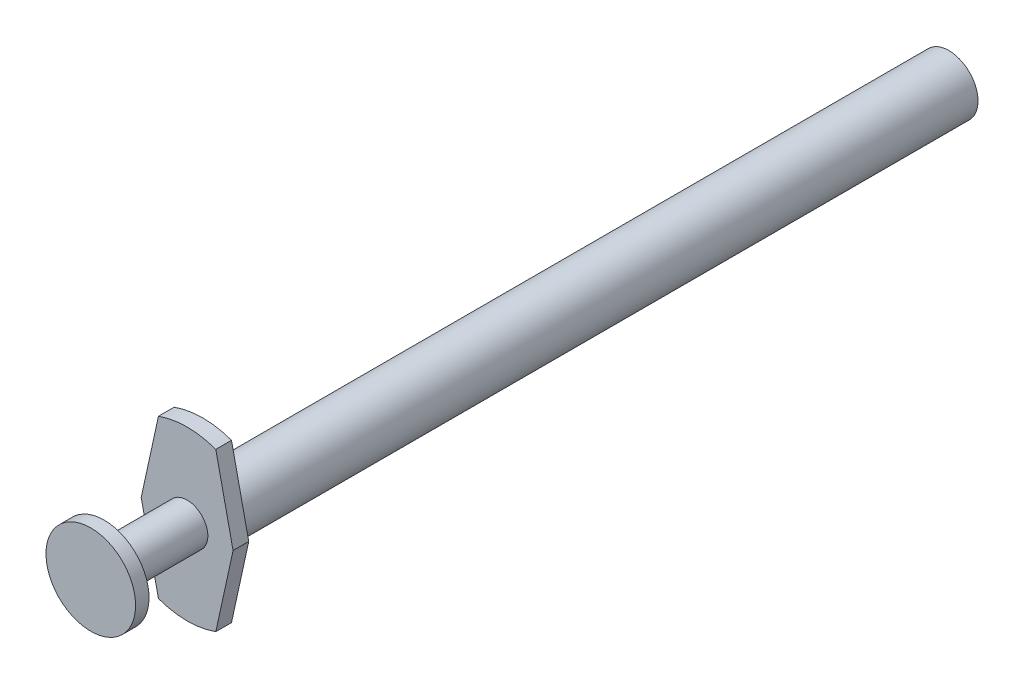
ISO-10303-21;
HEADER;
FILE_DESCRIPTION(('STEP AP214'),'2;1');
FILE_NAME('part.step','',(''),(''),'','','');
FILE_SCHEMA(('AUTOMOTIVE_DESIGN { 1 0 10303 214 1 1 1 1 }'));
ENDSEC;
DATA;
#1=APPLICATION_CONTEXT('core data for automotive mechanical design processes');
#2=APPLICATION_PROTOCOL_DEFINITION('international standard','automotive_design',2000,#1);
#3=PRODUCT_CONTEXT('',#1,'mechanical');
#4=PRODUCT('Part','Part','',(#3));
#5=PRODUCT_RELATED_PRODUCT_CATEGORY('part','',(#4));
#6=PRODUCT_DEFINITION_FORMATION('','',#4);
#7=PRODUCT_DEFINITION_CONTEXT('part definition',#1,'design');
#8=PRODUCT_DEFINITION('design','',#6,#7);
#9=PRODUCT_DEFINITION_SHAPE('','',#8);
#10=(LENGTH_UNIT() NAMED_UNIT(*) SI_UNIT(.MILLI.,.METRE.));
#11=(NAMED_UNIT(*) PLANE_ANGLE_UNIT() SI_UNIT($,.RADIAN.));
#12=(NAMED_UNIT(*) SI_UNIT($,.STERADIAN.) SOLID_ANGLE_UNIT());
#13=UNCERTAINTY_MEASURE_WITH_UNIT(LENGTH_MEASURE(1.E-05),#10,'distance_accuracy_value','');
#14=(GEOMETRIC_REPRESENTATION_CONTEXT(3) GLOBAL_UNCERTAINTY_ASSIGNED_CONTEXT((#13)) GLOBAL_UNIT_ASSIGNED_CONTEXT((#10,
#11,#12)) REPRESENTATION_CONTEXT('',''));
#15=CARTESIAN_POINT('',(0.,0.,0.));
#16=DIRECTION('',(0.,0.,1.));
#17=DIRECTION('',(1.,0.,0.));
#18=AXIS2_PLACEMENT_3D('',#15,#16,#17);
#19=CARTESIAN_POINT('',(0.,0.,-97.282));
#20=DIRECTION('',(0.,0.,-1.));
#21=DIRECTION('',(0.,1.,0.));
#22=AXIS2_PLACEMENT_3D('',#19,#20,#21);
#23=CYLINDRICAL_SURFACE('',#22,9.52499999999999);
#24=CARTESIAN_POINT('',(0.,0.,-12.7));
#25=DIRECTION('',(0.,0.,-1.));
#26=DIRECTION('',(0.,1.,0.));
#27=AXIS2_PLACEMENT_3D('',#24,#25,#26);
#28=CIRCLE('',#27,9.52499999999999);
#29=CARTESIAN_POINT('',(3.25214663047552,-8.95260673177854,-12.7));
#30=VERTEX_POINT('',#29);
#31=CARTESIAN_POINT('',(-3.25214663047552,-8.95260673177854,-12.7));
#32=VERTEX_POINT('',#31);
#33=EDGE_CURVE('E167',#30,#32,#28,.T.);
#34=ORIENTED_EDGE('',*,*,#33,.F.);
#35=DIRECTION('',(0.,0.,-1.));
#36=VECTOR('',#35,1.);
#37=CARTESIAN_POINT('',(3.25214663047553,-8.95260673177851,-97.282));
#38=LINE('',#37,#36);
#39=CARTESIAN_POINT('',(3.25214663047552,-8.95260673177854,-10.922));
#40=VERTEX_POINT('',#39);
#41=EDGE_CURVE('E94',#30,#40,#38,.F.);
#42=ORIENTED_EDGE('',*,*,#41,.T.);
#43=CARTESIAN_POINT('',(0.,0.,-10.922));
#44=DIRECTION('',(0.,0.,-1.));
#45=DIRECTION('',(0.,1.,0.));
#46=AXIS2_PLACEMENT_3D('',#43,#44,#45);
#47=CIRCLE('',#46,9.52499999999999);
#48=CARTESIAN_POINT('',(-3.25214663047552,-8.95260673177854,-10.922));
#49=VERTEX_POINT('',#48);
#50=EDGE_CURVE('E145',#40,#49,#47,.T.);
#51=ORIENTED_EDGE('',*,*,#50,.T.);
#52=DIRECTION('',(0.,0.,-1.));
#53=VECTOR('',#52,1.);
#54=CARTESIAN_POINT('',(-3.25214663047553,-8.95260673177851,-97.282));
#55=LINE('',#54,#53);
#56=EDGE_CURVE('E138',#49,#32,#55,.T.);
#57=ORIENTED_EDGE('',*,*,#56,.T.);
#58=EDGE_LOOP('',(#34,#42,#51,#57));
#59=FACE_BOUND('',#58,.T.);
#60=ADVANCED_FACE('F71',(#59),#23,.T.);
#61=CARTESIAN_POINT('',(0.,0.,0.));
#62=DIRECTION('',(0.,0.,1.));
#63=DIRECTION('',(0.,-1.,0.));
#64=AXIS2_PLACEMENT_3D('',#61,#62,#63);
#65=PLANE('',#64);
#66=CARTESIAN_POINT('',(0.,0.,0.));
#67=DIRECTION('',(0.,0.,-1.));
#68=DIRECTION('',(0.,1.,0.));
#69=AXIS2_PLACEMENT_3D('',#66,#67,#68);
#70=CIRCLE('',#69,5.08);
#71=CARTESIAN_POINT('',(0.,5.08,0.));
#72=VERTEX_POINT('',#71);
#73=EDGE_CURVE('E179',#72,#72,#70,.T.);
#74=ORIENTED_EDGE('',*,*,#73,.F.);
#75=EDGE_LOOP('',(#74));
#76=FACE_BOUND('',#75,.T.);
#77=ADVANCED_FACE('F73',(#76),#65,.T.);
#78=CARTESIAN_POINT('',(0.,0.,-97.282));
#79=DIRECTION('',(0.,0.,-1.));
#80=DIRECTION('',(0.,1.,0.));
#81=AXIS2_PLACEMENT_3D('',#78,#79,#80);
#82=CYLINDRICAL_SURFACE('',#81,5.08);
#83=ORIENTED_EDGE('',*,*,#73,.T.);
#84=EDGE_LOOP('',(#83));
#85=FACE_BOUND('',#84,.T.);
#86=CARTESIAN_POINT('',(0.,0.,-1.524));
#87=DIRECTION('',(0.,0.,-1.));
#88=DIRECTION('',(0.,1.,0.));
#89=AXIS2_PLACEMENT_3D('',#86,#87,#88);
#90=CIRCLE('',#89,5.08);
#91=CARTESIAN_POINT('',(0.,5.08,-1.524));
#92=VERTEX_POINT('',#91);
#93=EDGE_CURVE('E176',#92,#92,#90,.T.);
#94=ORIENTED_EDGE('',*,*,#93,.F.);
#95=EDGE_LOOP('',(#94));
#96=FACE_BOUND('',#95,.T.);
#97=ADVANCED_FACE('F215',(#85,#96),#82,.T.);
#98=CARTESIAN_POINT('',(0.,5.08,-1.524));
#99=DIRECTION('',(0.,0.,-1.));
#100=DIRECTION('',(0.,1.,0.));
#101=AXIS2_PLACEMENT_3D('',#98,#99,#100);
#102=PLANE('',#101);
#103=ORIENTED_EDGE('',*,*,#93,.T.);
#104=EDGE_LOOP('',(#103));
#105=FACE_BOUND('',#104,.T.);
#106=CARTESIAN_POINT('',(0.,0.,-1.524));
#107=DIRECTION('',(0.,0.,-1.));
#108=DIRECTION('',(0.,1.,0.));
#109=AXIS2_PLACEMENT_3D('',#106,#107,#108);
#110=CIRCLE('',#109,2.34949999999999);
#111=CARTESIAN_POINT('',(0.,2.34949999999999,-1.524));
#112=VERTEX_POINT('',#111);
#113=EDGE_CURVE('E173',#112,#112,#110,.T.);
#114=ORIENTED_EDGE('',*,*,#113,.F.);
#115=EDGE_LOOP('',(#114));
#116=FACE_BOUND('',#115,.T.);
#117=ADVANCED_FACE('F220',(#105,#116),#102,.T.);
#118=CARTESIAN_POINT('',(0.,0.,-97.282));
#119=DIRECTION('',(0.,0.,-1.));
#120=DIRECTION('',(0.,1.,0.));
#121=AXIS2_PLACEMENT_3D('',#118,#119,#120);
#122=CYLINDRICAL_SURFACE('',#121,2.34949999999999);
#123=ORIENTED_EDGE('',*,*,#113,.T.);
#124=EDGE_LOOP('',(#123));
#125=FACE_BOUND('',#124,.T.);
#126=CARTESIAN_POINT('',(0.,0.,-10.922));
#127=DIRECTION('',(0.,0.,-1.));
#128=DIRECTION('',(0.,1.,0.));
#129=AXIS2_PLACEMENT_3D('',#126,#127,#128);
#130=CIRCLE('',#129,2.34949999999998);
#131=CARTESIAN_POINT('',(0.,2.34949999999999,-10.922));
#132=VERTEX_POINT('',#131);
#133=EDGE_CURVE('E170',#132,#132,#130,.T.);
#134=ORIENTED_EDGE('',*,*,#133,.F.);
#135=EDGE_LOOP('',(#134));
#136=FACE_BOUND('',#135,.T.);
#137=ADVANCED_FACE('F209',(#125,#136),#122,.T.);
#138=CARTESIAN_POINT('',(0.,2.34949999999999,-10.922));
#139=DIRECTION('',(0.,0.,1.));
#140=DIRECTION('',(0.,-1.,0.));
#141=AXIS2_PLACEMENT_3D('',#138,#139,#140);
#142=PLANE('',#141);
#143=DIRECTION('',(0.213329300785652,-0.976980352630648,0.));
#144=VECTOR('',#143,1.);
#145=CARTESIAN_POINT('',(0.,23.8464040214486,-10.922));
#146=LINE('',#145,#144);
#147=CARTESIAN_POINT('',(3.25214663047552,8.95260673177856,-10.922));
#148=VERTEX_POINT('',#147);
#149=CARTESIAN_POINT('',(5.207,0.,-10.922));
#150=VERTEX_POINT('',#149);
#151=EDGE_CURVE('E123',#148,#150,#146,.T.);
#152=ORIENTED_EDGE('',*,*,#151,.F.);
#153=CARTESIAN_POINT('',(-3.25214663047552,8.95260673177856,-10.922));
#154=VERTEX_POINT('',#153);
#155=EDGE_CURVE('E168',#154,#148,#47,.T.);
#156=ORIENTED_EDGE('',*,*,#155,.F.);
#157=DIRECTION('',(0.213329300785652,0.976980352630648,0.));
#158=VECTOR('',#157,1.);
#159=CARTESIAN_POINT('',(-5.207,0.,-10.922));
#160=LINE('',#159,#158);
#161=CARTESIAN_POINT('',(-5.207,0.,-10.922));
#162=VERTEX_POINT('',#161);
#163=EDGE_CURVE('E135',#162,#154,#160,.T.);
#164=ORIENTED_EDGE('',*,*,#163,.F.);
#165=DIRECTION('',(0.213329300785652,-0.976980352630648,0.));
#166=VECTOR('',#165,1.);
#167=CARTESIAN_POINT('',(-5.207,0.,-10.922));
#168=LINE('',#167,#166);
#169=EDGE_CURVE('E146',#162,#49,#168,.T.);
#170=ORIENTED_EDGE('',*,*,#169,.T.);
#171=ORIENTED_EDGE('',*,*,#50,.F.);
#172=DIRECTION('',(0.213329300785652,0.976980352630648,0.));
#173=VECTOR('',#172,1.);
#174=CARTESIAN_POINT('',(0.,-23.8464040214486,-10.922));
#175=LINE('',#174,#173);
#176=EDGE_CURVE('E134',#40,#150,#175,.T.);
#177=ORIENTED_EDGE('',*,*,#176,.T.);
#178=EDGE_LOOP('',(#152,#156,#164,#170,#171,#177));
#179=FACE_BOUND('',#178,.T.);
#180=ORIENTED_EDGE('',*,*,#133,.T.);
#181=EDGE_LOOP('',(#180));
#182=FACE_BOUND('',#181,.T.);
#183=ADVANCED_FACE('F141',(#179,#182),#142,.T.);
#184=DIRECTION('',(0.,0.,-1.));
#185=VECTOR('',#184,1.);
#186=CARTESIAN_POINT('',(-3.25214663047551,8.95260673177858,-97.282));
#187=LINE('',#186,#185);
#188=CARTESIAN_POINT('',(-3.25214663047552,8.95260673177855,-12.7));
#189=VERTEX_POINT('',#188);
#190=EDGE_CURVE('E156',#154,#189,#187,.T.);
#191=ORIENTED_EDGE('',*,*,#190,.F.);
#192=ORIENTED_EDGE('',*,*,#155,.T.);
#193=DIRECTION('',(0.,0.,-1.));
#194=VECTOR('',#193,1.);
#195=CARTESIAN_POINT('',(3.25214663047551,8.95260673177858,-97.282));
#196=LINE('',#195,#194);
#197=CARTESIAN_POINT('',(3.25214663047552,8.95260673177855,-12.7));
#198=VERTEX_POINT('',#197);
#199=EDGE_CURVE('E129',#198,#148,#196,.F.);
#200=ORIENTED_EDGE('',*,*,#199,.F.);
#201=EDGE_CURVE('E164',#189,#198,#28,.T.);
#202=ORIENTED_EDGE('',*,*,#201,.F.);
#203=EDGE_LOOP('',(#191,#192,#200,#202));
#204=FACE_BOUND('',#203,.T.);
#205=ADVANCED_FACE('F200',(#204),#23,.T.);
#206=CARTESIAN_POINT('',(0.,9.52499999999999,-12.7));
#207=DIRECTION('',(0.,0.,-1.));
#208=DIRECTION('',(0.,1.,0.));
#209=AXIS2_PLACEMENT_3D('',#206,#207,#208);
#210=PLANE('',#209);
#211=DIRECTION('',(-0.213329300785652,0.976980352630648,0.));
#212=VECTOR('',#211,1.);
#213=CARTESIAN_POINT('',(2.98484605256892,10.1767583691758,-12.7));
#214=LINE('',#213,#212);
#215=CARTESIAN_POINT('',(5.207,0.,-12.7));
#216=VERTEX_POINT('',#215);
#217=EDGE_CURVE('E15',#216,#198,#214,.T.);
#218=ORIENTED_EDGE('',*,*,#217,.F.);
#219=DIRECTION('',(-0.213329300785652,-0.976980352630648,0.));
#220=VECTOR('',#219,1.);
#221=CARTESIAN_POINT('',(6.95521915399662,8.00628774039531,-12.7));
#222=LINE('',#221,#220);
#223=EDGE_CURVE('E79',#216,#30,#222,.T.);
#224=ORIENTED_EDGE('',*,*,#223,.T.);
#225=ORIENTED_EDGE('',*,*,#33,.T.);
#226=DIRECTION('',(-0.213329300785652,0.976980352630648,0.));
#227=VECTOR('',#226,1.);
#228=CARTESIAN_POINT('',(-6.95521915399662,8.00628774039531,-12.7));
#229=LINE('',#228,#227);
#230=CARTESIAN_POINT('',(-5.207,0.,-12.7));
#231=VERTEX_POINT('',#230);
#232=EDGE_CURVE('E182',#32,#231,#229,.T.);
#233=ORIENTED_EDGE('',*,*,#232,.T.);
#234=DIRECTION('',(-0.213329300785652,-0.976980352630648,0.));
#235=VECTOR('',#234,1.);
#236=CARTESIAN_POINT('',(-2.98484605256892,10.1767583691758,-12.7));
#237=LINE('',#236,#235);
#238=EDGE_CURVE('E185',#189,#231,#237,.T.);
#239=ORIENTED_EDGE('',*,*,#238,.F.);
#240=ORIENTED_EDGE('',*,*,#201,.T.);
#241=EDGE_LOOP('',(#218,#224,#225,#233,#239,#240));
#242=FACE_BOUND('',#241,.T.);
#243=CARTESIAN_POINT('',(0.,0.,-12.7));
#244=DIRECTION('',(0.,0.,-1.));
#245=DIRECTION('',(0.,1.,0.));
#246=AXIS2_PLACEMENT_3D('',#243,#244,#245);
#247=CIRCLE('',#246,3.30200000000003);
#248=CARTESIAN_POINT('',(0.,3.30200000000003,-12.7));
#249=VERTEX_POINT('',#248);
#250=EDGE_CURVE('E161',#249,#249,#247,.T.);
#251=ORIENTED_EDGE('',*,*,#250,.F.);
#252=EDGE_LOOP('',(#251));
#253=FACE_BOUND('',#252,.T.);
#254=ADVANCED_FACE('F189',(#242,#253),#210,.T.);
#255=CARTESIAN_POINT('',(0.,0.,-97.282));
#256=DIRECTION('',(0.,0.,-1.));
#257=DIRECTION('',(0.,1.,0.));
#258=AXIS2_PLACEMENT_3D('',#255,#256,#257);
#259=CYLINDRICAL_SURFACE('',#258,3.30200000000001);
#260=ORIENTED_EDGE('',*,*,#250,.T.);
#261=EDGE_LOOP('',(#260));
#262=FACE_BOUND('',#261,.T.);
#263=CARTESIAN_POINT('',(0.,0.,-97.282));
#264=DIRECTION('',(0.,0.,-1.));
#265=DIRECTION('',(0.,1.,0.));
#266=AXIS2_PLACEMENT_3D('',#263,#264,#265);
#267=CIRCLE('',#266,3.302);
#268=CARTESIAN_POINT('',(0.,3.30200000000003,-97.282));
#269=VERTEX_POINT('',#268);
#270=EDGE_CURVE('E158',#269,#269,#267,.T.);
#271=ORIENTED_EDGE('',*,*,#270,.F.);
#272=EDGE_LOOP('',(#271));
#273=FACE_BOUND('',#272,.T.);
#274=ADVANCED_FACE('F207',(#262,#273),#259,.T.);
#275=CARTESIAN_POINT('',(0.,3.30200000000003,-97.282));
#276=DIRECTION('',(0.,0.,-1.));
#277=DIRECTION('',(0.,1.,0.));
#278=AXIS2_PLACEMENT_3D('',#275,#276,#277);
#279=PLANE('',#278);
#280=ORIENTED_EDGE('',*,*,#270,.T.);
#281=EDGE_LOOP('',(#280));
#282=FACE_BOUND('',#281,.T.);
#283=ADVANCED_FACE('F268',(#282),#279,.T.);
#284=CARTESIAN_POINT('',(-5.207,0.,-13.462));
#285=DIRECTION('',(-0.976980352630648,-0.213329300785652,0.));
#286=DIRECTION('',(0.213329300785652,-0.976980352630648,0.));
#287=AXIS2_PLACEMENT_3D('',#284,#285,#286);
#288=PLANE('',#287);
#289=ORIENTED_EDGE('',*,*,#169,.F.);
#290=DIRECTION('',(0.,0.,1.));
#291=VECTOR('',#290,1.);
#292=CARTESIAN_POINT('',(-5.207,0.,-13.462));
#293=LINE('',#292,#291);
#294=EDGE_CURVE('E86',#231,#162,#293,.T.);
#295=ORIENTED_EDGE('',*,*,#294,.F.);
#296=ORIENTED_EDGE('',*,*,#232,.F.);
#297=ORIENTED_EDGE('',*,*,#56,.F.);
#298=EDGE_LOOP('',(#289,#295,#296,#297));
#299=FACE_BOUND('',#298,.T.);
#300=ADVANCED_FACE('F192',(#299),#288,.T.);
#301=CARTESIAN_POINT('',(-5.207,0.,-13.462));
#302=DIRECTION('',(0.976980352630648,-0.213329300785652,0.));
#303=DIRECTION('',(0.213329300785652,0.976980352630648,0.));
#304=AXIS2_PLACEMENT_3D('',#301,#302,#303);
#305=PLANE('',#304);
#306=ORIENTED_EDGE('',*,*,#190,.T.);
#307=ORIENTED_EDGE('',*,*,#238,.T.);
#308=ORIENTED_EDGE('',*,*,#294,.T.);
#309=ORIENTED_EDGE('',*,*,#163,.T.);
#310=EDGE_LOOP('',(#306,#307,#308,#309));
#311=FACE_BOUND('',#310,.T.);
#312=ADVANCED_FACE('F196',(#311),#305,.F.);
#313=CARTESIAN_POINT('',(0.,23.8464040214486,-13.462));
#314=DIRECTION('',(-0.976980352630648,-0.213329300785652,0.));
#315=DIRECTION('',(0.213329300785652,-0.976980352630648,0.));
#316=AXIS2_PLACEMENT_3D('',#313,#314,#315);
#317=PLANE('',#316);
#318=ORIENTED_EDGE('',*,*,#199,.T.);
#319=ORIENTED_EDGE('',*,*,#151,.T.);
#320=DIRECTION('',(0.,0.,1.));
#321=VECTOR('',#320,1.);
#322=CARTESIAN_POINT('',(5.207,0.,-13.462));
#323=LINE('',#322,#321);
#324=EDGE_CURVE('E126',#216,#150,#323,.T.);
#325=ORIENTED_EDGE('',*,*,#324,.F.);
#326=ORIENTED_EDGE('',*,*,#217,.T.);
#327=EDGE_LOOP('',(#318,#319,#325,#326));
#328=FACE_BOUND('',#327,.T.);
#329=ADVANCED_FACE('F125',(#328),#317,.F.);
#330=CARTESIAN_POINT('',(0.,-23.8464040214486,-13.462));
#331=DIRECTION('',(0.976980352630648,-0.213329300785652,0.));
#332=DIRECTION('',(0.213329300785652,0.976980352630648,0.));
#333=AXIS2_PLACEMENT_3D('',#330,#331,#332);
#334=PLANE('',#333);
#335=ORIENTED_EDGE('',*,*,#223,.F.);
#336=ORIENTED_EDGE('',*,*,#324,.T.);
#337=ORIENTED_EDGE('',*,*,#176,.F.);
#338=ORIENTED_EDGE('',*,*,#41,.F.);
#339=EDGE_LOOP('',(#335,#336,#337,#338));
#340=FACE_BOUND('',#339,.T.);
#341=ADVANCED_FACE('F137',(#340),#334,.T.);
#342=CLOSED_SHELL('',(#60,#77,#97,#117,#137,#183,#205,#254,#274,#283,#300,#312,#329,#341));
#343=MANIFOLD_SOLID_BREP('B2',#342);
#344=ADVANCED_BREP_SHAPE_REPRESENTATION('',(#18,#343),#14);
#345=SHAPE_DEFINITION_REPRESENTATION(#9,#344);
ENDSEC;
END-ISO-10303-21;
